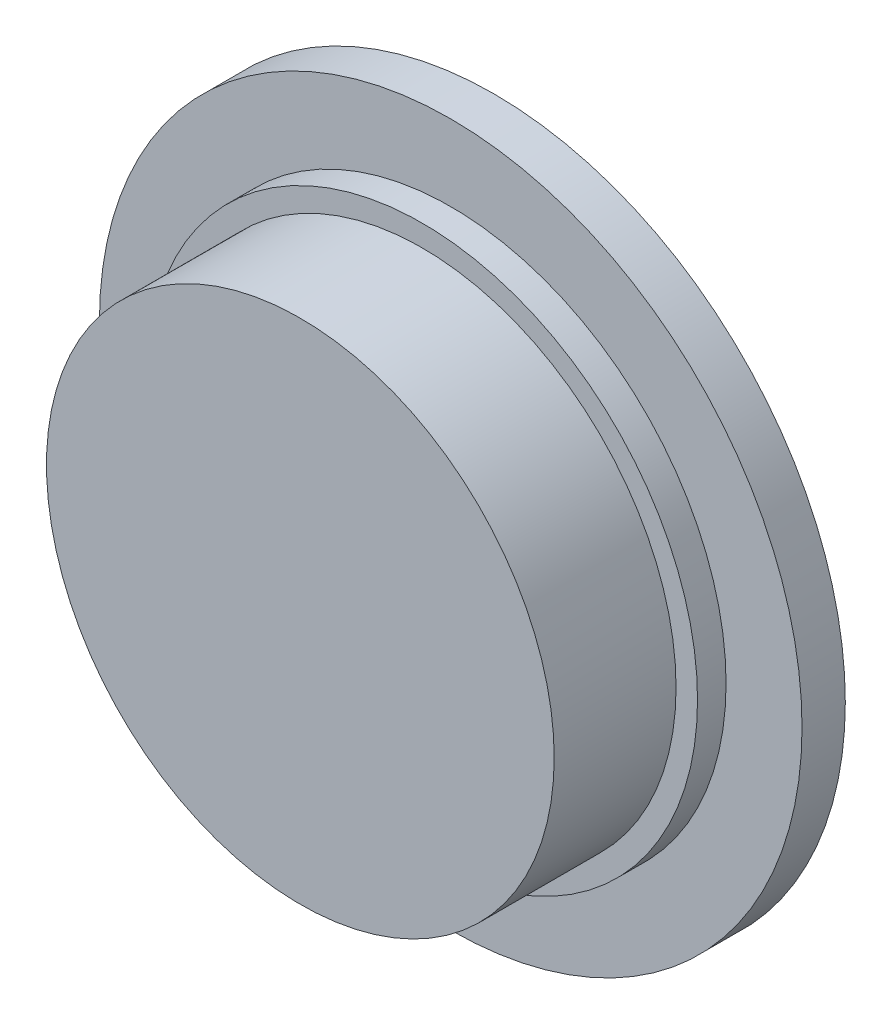
ISO-10303-21;
HEADER;
FILE_DESCRIPTION(('STEP AP214'),'2;1');
FILE_NAME('part.step','',(''),(''),'','','');
FILE_SCHEMA(('AUTOMOTIVE_DESIGN { 1 0 10303 214 1 1 1 1 }'));
ENDSEC;
DATA;
#1=APPLICATION_CONTEXT('core data for automotive mechanical design processes');
#2=APPLICATION_PROTOCOL_DEFINITION('international standard','automotive_design',2000,#1);
#3=PRODUCT_CONTEXT('',#1,'mechanical');
#4=PRODUCT('Part','Part','',(#3));
#5=PRODUCT_RELATED_PRODUCT_CATEGORY('part','',(#4));
#6=PRODUCT_DEFINITION_FORMATION('','',#4);
#7=PRODUCT_DEFINITION_CONTEXT('part definition',#1,'design');
#8=PRODUCT_DEFINITION('design','',#6,#7);
#9=PRODUCT_DEFINITION_SHAPE('','',#8);
#10=(LENGTH_UNIT() NAMED_UNIT(*) SI_UNIT(.MILLI.,.METRE.));
#11=(NAMED_UNIT(*) PLANE_ANGLE_UNIT() SI_UNIT($,.RADIAN.));
#12=(NAMED_UNIT(*) SI_UNIT($,.STERADIAN.) SOLID_ANGLE_UNIT());
#13=UNCERTAINTY_MEASURE_WITH_UNIT(LENGTH_MEASURE(1.E-05),#10,'distance_accuracy_value','');
#14=(GEOMETRIC_REPRESENTATION_CONTEXT(3) GLOBAL_UNCERTAINTY_ASSIGNED_CONTEXT((#13)) GLOBAL_UNIT_ASSIGNED_CONTEXT((#10,
#11,#12)) REPRESENTATION_CONTEXT('',''));
#15=CARTESIAN_POINT('',(0.,0.,0.));
#16=DIRECTION('',(0.,0.,1.));
#17=DIRECTION('',(1.,0.,0.));
#18=AXIS2_PLACEMENT_3D('',#15,#16,#17);
#19=CARTESIAN_POINT('',(8.48433946662404,0.,4.06635487942796));
#20=DIRECTION('',(0.,0.,-1.));
#21=DIRECTION('',(-1.,0.,0.));
#22=AXIS2_PLACEMENT_3D('',#19,#20,#21);
#23=PLANE('',#22);
#24=CARTESIAN_POINT('',(0.,0.,4.06635487942796));
#25=DIRECTION('',(0.,0.,1.));
#26=DIRECTION('',(1.,0.,0.));
#27=AXIS2_PLACEMENT_3D('',#24,#25,#26);
#28=CIRCLE('',#27,6.86481711667044);
#29=CARTESIAN_POINT('',(6.86481711667044,0.,4.06635487942796));
#30=VERTEX_POINT('',#29);
#31=EDGE_CURVE('E11',#30,#30,#28,.T.);
#32=ORIENTED_EDGE('',*,*,#31,.T.);
#33=EDGE_LOOP('',(#32));
#34=FACE_BOUND('',#33,.T.);
#35=ADVANCED_FACE('F33',(#34),#23,.F.);
#36=CARTESIAN_POINT('',(0.,-4.606090184614E-06,23.5399802795497));
#37=DIRECTION('',(0.,0.,1.));
#38=DIRECTION('',(0.,1.,0.));
#39=AXIS2_PLACEMENT_3D('',#36,#37,#38);
#40=SPHERICAL_SURFACE('',#39,26.4736254001221);
#41=CARTESIAN_POINT('',(0.,0.,-1.1703971823641));
#42=DIRECTION('',(0.,0.,1.));
#43=DIRECTION('',(1.,0.,0.));
#44=AXIS2_PLACEMENT_3D('',#41,#42,#43);
#45=CIRCLE('',#44,9.5);
#46=CARTESIAN_POINT('',(9.5,0.,-1.1703971823641));
#47=VERTEX_POINT('',#46);
#48=EDGE_CURVE('E36',#47,#47,#45,.T.);
#49=ORIENTED_EDGE('',*,*,#48,.F.);
#50=EDGE_LOOP('',(#49));
#51=FACE_BOUND('',#50,.T.);
#52=ADVANCED_FACE('F62',(#51),#40,.T.);
#53=CARTESIAN_POINT('',(0.,0.,38.9319607545086));
#54=DIRECTION('',(0.,0.,1.));
#55=DIRECTION('',(1.,0.,0.));
#56=AXIS2_PLACEMENT_3D('',#53,#54,#55);
#57=CYLINDRICAL_SURFACE('',#56,9.5);
#58=CARTESIAN_POINT('',(0.,0.,-1.77082911528847E-06));
#59=DIRECTION('',(0.,0.,1.));
#60=DIRECTION('',(1.,0.,0.));
#61=AXIS2_PLACEMENT_3D('',#58,#59,#60);
#62=CIRCLE('',#61,9.5);
#63=CARTESIAN_POINT('',(9.5,0.,-1.77082911528847E-06));
#64=VERTEX_POINT('',#63);
#65=EDGE_CURVE('E53',#64,#64,#62,.T.);
#66=ORIENTED_EDGE('',*,*,#65,.F.);
#67=EDGE_LOOP('',(#66));
#68=FACE_BOUND('',#67,.T.);
#69=ORIENTED_EDGE('',*,*,#48,.T.);
#70=EDGE_LOOP('',(#69));
#71=FACE_BOUND('',#70,.T.);
#72=ADVANCED_FACE('F59',(#68,#71),#57,.T.);
#73=CARTESIAN_POINT('',(0.,9.5,-1.77082911526562E-06));
#74=DIRECTION('',(0.,0.,-1.));
#75=DIRECTION('',(-1.,0.,0.));
#76=AXIS2_PLACEMENT_3D('',#73,#74,#75);
#77=PLANE('',#76);
#78=CARTESIAN_POINT('',(0.,0.,-1.77082911528847E-06));
#79=DIRECTION('',(0.,0.,1.));
#80=DIRECTION('',(1.,0.,0.));
#81=AXIS2_PLACEMENT_3D('',#78,#79,#80);
#82=CIRCLE('',#81,7.44561133872276);
#83=CARTESIAN_POINT('',(7.44561133872276,0.,-1.77082911528847E-06));
#84=VERTEX_POINT('',#83);
#85=EDGE_CURVE('E50',#84,#84,#82,.T.);
#86=ORIENTED_EDGE('',*,*,#85,.F.);
#87=EDGE_LOOP('',(#86));
#88=FACE_BOUND('',#87,.T.);
#89=ORIENTED_EDGE('',*,*,#65,.T.);
#90=EDGE_LOOP('',(#89));
#91=FACE_BOUND('',#90,.T.);
#92=ADVANCED_FACE('F57',(#88,#91),#77,.F.);
#93=CARTESIAN_POINT('',(0.,0.,38.9319607545086));
#94=DIRECTION('',(0.,0.,1.));
#95=DIRECTION('',(1.,0.,0.));
#96=AXIS2_PLACEMENT_3D('',#93,#94,#95);
#97=CYLINDRICAL_SURFACE('',#96,7.44561133872276);
#98=CARTESIAN_POINT('',(0.,0.,0.771464581246509));
#99=DIRECTION('',(0.,0.,1.));
#100=DIRECTION('',(1.,0.,0.));
#101=AXIS2_PLACEMENT_3D('',#98,#99,#100);
#102=CIRCLE('',#101,7.44561133872276);
#103=CARTESIAN_POINT('',(7.44561133872276,0.,0.771464581246509));
#104=VERTEX_POINT('',#103);
#105=EDGE_CURVE('E47',#104,#104,#102,.T.);
#106=ORIENTED_EDGE('',*,*,#105,.F.);
#107=EDGE_LOOP('',(#106));
#108=FACE_BOUND('',#107,.T.);
#109=ORIENTED_EDGE('',*,*,#85,.T.);
#110=EDGE_LOOP('',(#109));
#111=FACE_BOUND('',#110,.T.);
#112=ADVANCED_FACE('F78',(#108,#111),#97,.T.);
#113=CARTESIAN_POINT('',(0.,7.44561133872276,0.771464581246508));
#114=DIRECTION('',(0.,0.,-1.));
#115=DIRECTION('',(-1.,0.,0.));
#116=AXIS2_PLACEMENT_3D('',#113,#114,#115);
#117=PLANE('',#116);
#118=CARTESIAN_POINT('',(0.,0.,0.771464581246509));
#119=DIRECTION('',(0.,0.,1.));
#120=DIRECTION('',(1.,0.,0.));
#121=AXIS2_PLACEMENT_3D('',#118,#119,#120);
#122=CIRCLE('',#121,6.86481711667044);
#123=CARTESIAN_POINT('',(6.86481711667044,0.,0.771464581246509));
#124=VERTEX_POINT('',#123);
#125=EDGE_CURVE('E43',#124,#124,#122,.T.);
#126=ORIENTED_EDGE('',*,*,#125,.F.);
#127=EDGE_LOOP('',(#126));
#128=FACE_BOUND('',#127,.T.);
#129=ORIENTED_EDGE('',*,*,#105,.T.);
#130=EDGE_LOOP('',(#129));
#131=FACE_BOUND('',#130,.T.);
#132=ADVANCED_FACE('F74',(#128,#131),#117,.F.);
#133=CARTESIAN_POINT('',(0.,0.,38.9319607545086));
#134=DIRECTION('',(0.,0.,1.));
#135=DIRECTION('',(1.,0.,0.));
#136=AXIS2_PLACEMENT_3D('',#133,#134,#135);
#137=CYLINDRICAL_SURFACE('',#136,6.86481711667044);
#138=ORIENTED_EDGE('',*,*,#31,.F.);
#139=EDGE_LOOP('',(#138));
#140=FACE_BOUND('',#139,.T.);
#141=ORIENTED_EDGE('',*,*,#125,.T.);
#142=EDGE_LOOP('',(#141));
#143=FACE_BOUND('',#142,.T.);
#144=ADVANCED_FACE('F70',(#140,#143),#137,.T.);
#145=CLOSED_SHELL('',(#35,#52,#72,#92,#112,#132,#144));
#146=MANIFOLD_SOLID_BREP('B2',#145);
#147=ADVANCED_BREP_SHAPE_REPRESENTATION('',(#18,#146),#14);
#148=SHAPE_DEFINITION_REPRESENTATION(#9,#147);
ENDSEC;
END-ISO-10303-21;
